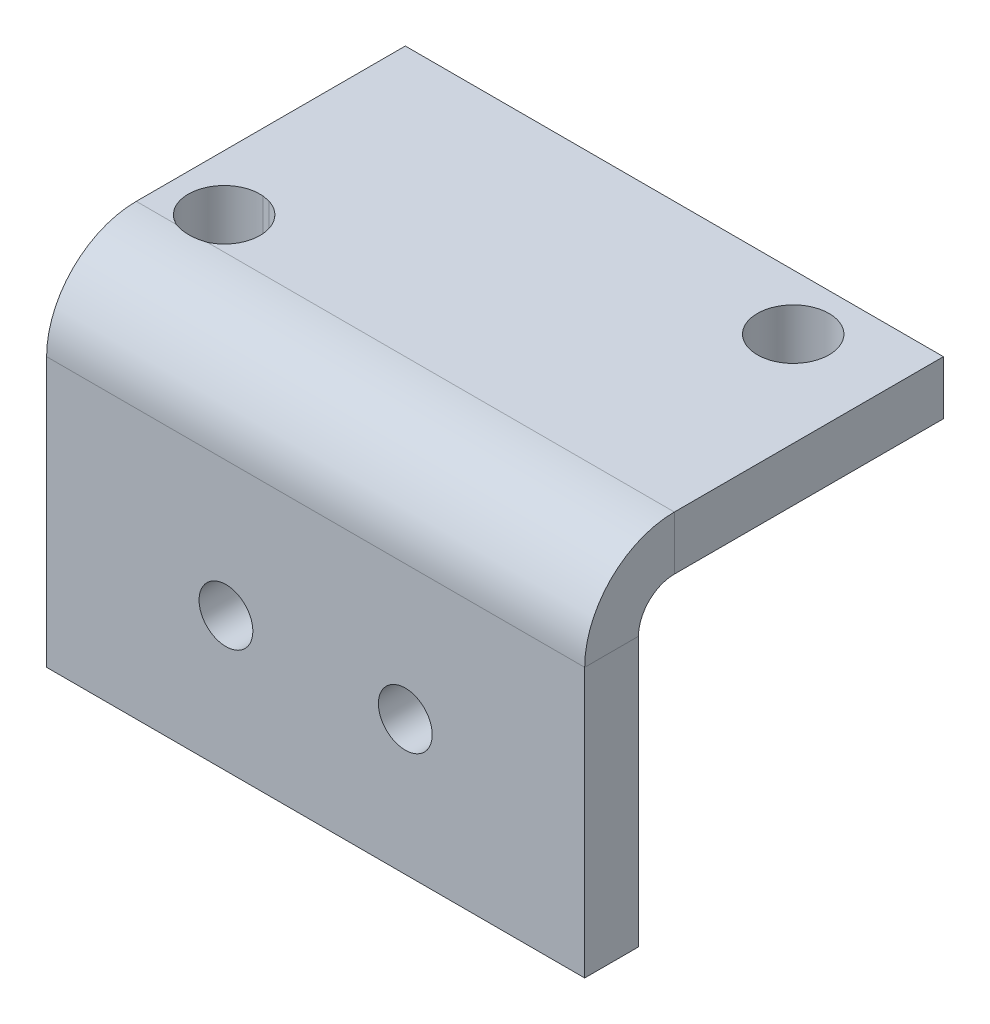
ISO-10303-21;
HEADER;
FILE_DESCRIPTION(('STEP AP214'),'2;1');
FILE_NAME('part.step','',(''),(''),'','','');
FILE_SCHEMA(('AUTOMOTIVE_DESIGN { 1 0 10303 214 1 1 1 1 }'));
ENDSEC;
DATA;
#1=APPLICATION_CONTEXT('core data for automotive mechanical design processes');
#2=APPLICATION_PROTOCOL_DEFINITION('international standard','automotive_design',2000,#1);
#3=PRODUCT_CONTEXT('',#1,'mechanical');
#4=PRODUCT('Part','Part','',(#3));
#5=PRODUCT_RELATED_PRODUCT_CATEGORY('part','',(#4));
#6=PRODUCT_DEFINITION_FORMATION('','',#4);
#7=PRODUCT_DEFINITION_CONTEXT('part definition',#1,'design');
#8=PRODUCT_DEFINITION('design','',#6,#7);
#9=PRODUCT_DEFINITION_SHAPE('','',#8);
#10=(LENGTH_UNIT() NAMED_UNIT(*) SI_UNIT(.MILLI.,.METRE.));
#11=(NAMED_UNIT(*) PLANE_ANGLE_UNIT() SI_UNIT($,.RADIAN.));
#12=(NAMED_UNIT(*) SI_UNIT($,.STERADIAN.) SOLID_ANGLE_UNIT());
#13=UNCERTAINTY_MEASURE_WITH_UNIT(LENGTH_MEASURE(1.E-05),#10,'distance_accuracy_value','');
#14=(GEOMETRIC_REPRESENTATION_CONTEXT(3) GLOBAL_UNCERTAINTY_ASSIGNED_CONTEXT((#13)) GLOBAL_UNIT_ASSIGNED_CONTEXT((#10,
#11,#12)) REPRESENTATION_CONTEXT('',''));
#15=CARTESIAN_POINT('',(0.,0.,0.));
#16=DIRECTION('',(0.,0.,1.));
#17=DIRECTION('',(1.,0.,0.));
#18=AXIS2_PLACEMENT_3D('',#15,#16,#17);
#19=CARTESIAN_POINT('',(30.,-3.,0.));
#20=DIRECTION('',(0.,1.,0.));
#21=DIRECTION('',(0.,0.,1.));
#22=AXIS2_PLACEMENT_3D('',#19,#20,#21);
#23=PLANE('',#22);
#24=DIRECTION('',(-1.,0.,0.));
#25=VECTOR('',#24,1.);
#26=CARTESIAN_POINT('',(30.,-3.,-5.));
#27=LINE('',#26,#25);
#28=CARTESIAN_POINT('',(30.,-3.,-5.));
#29=VERTEX_POINT('',#28);
#30=CARTESIAN_POINT('',(3.97177978870813,-3.,-5.));
#31=VERTEX_POINT('',#30);
#32=EDGE_CURVE('E335',#29,#31,#27,.T.);
#33=ORIENTED_EDGE('',*,*,#32,.T.);
#34=CARTESIAN_POINT('',(3.97177978870813,-3.,-5.));
#35=CARTESIAN_POINT('',(4.08845927120302,-3.,-5.06509952559211));
#36=CARTESIAN_POINT('',(4.3218182361928,-3.,-5.19529857677634));
#37=CARTESIAN_POINT('',(4.61378577689651,-3.,-5.47386881505234));
#38=CARTESIAN_POINT('',(4.84785068816003,-3.,-5.80019538875559));
#39=CARTESIAN_POINT('',(5.0115070238909,-3.,-6.16779528714309));
#40=CARTESIAN_POINT('',(5.09907413861079,-3.,-6.56025196964337));
#41=CARTESIAN_POINT('',(5.10682789130612,-3.,-6.96236621358011));
#42=CARTESIAN_POINT('',(5.03453051747204,-3.,-7.35800376942431));
#43=CARTESIAN_POINT('',(4.88501045455,-3.,-7.73127846452603));
#44=CARTESIAN_POINT('',(4.664386853921,-3.,-8.06778746643363));
#45=CARTESIAN_POINT('',(4.38090562154302,-3.,-8.3522409886111));
#46=CARTESIAN_POINT('',(4.04795226054604,-3.,-8.58025081708027));
#47=CARTESIAN_POINT('',(3.79669753878768,-3.,-8.67124127957223));
#48=CARTESIAN_POINT('',(3.6710701779085,-3.,-8.7167365108182));
#49=B_SPLINE_CURVE_WITH_KNOTS('',3,(#34,#35,#36,#37,#38,#39,#40,#41,#42,#43,#44,#45,#46,#47,
#48),.UNSPECIFIED.,.F.,.F.,(4,1,1,1,1,1,1,1,1,1,1,1,4),(0.,0.0833333333333335,0.166666666666667,
0.25,0.333333333333333,0.416666666666667,0.5,0.583333333333333,0.666666666666667,0.75,
0.833333333333333,0.916666666666667,1.),.UNSPECIFIED.);
#50=CARTESIAN_POINT('',(3.6710701779085,-3.,-8.7167365108182));
#51=VERTEX_POINT('',#50);
#52=EDGE_CURVE('E63',#31,#51,#49,.T.);
#53=ORIENTED_EDGE('',*,*,#52,.T.);
#54=DIRECTION('',(-0.982094208806006,0.,-0.188390458966757));
#55=VECTOR('',#54,1.);
#56=CARTESIAN_POINT('',(3.6710701779085,-3.,-8.7167365108182));
#57=LINE('',#56,#55);
#58=CARTESIAN_POINT('',(3.27872384877918,-3.,-8.7919984402297));
#59=VERTEX_POINT('',#58);
#60=EDGE_CURVE('E134',#51,#59,#57,.T.);
#61=ORIENTED_EDGE('',*,*,#60,.T.);
#62=CARTESIAN_POINT('',(3.27872384877918,-3.,-8.7919984402297));
#63=CARTESIAN_POINT('',(3.14517896328197,-3.,-8.79621898937111));
#64=CARTESIAN_POINT('',(2.87808919228757,-3.,-8.80466008765392));
#65=CARTESIAN_POINT('',(2.48439801057191,-3.,-8.71603900041082));
#66=CARTESIAN_POINT('',(2.11578133247524,-3.,-8.55667440796584));
#67=CARTESIAN_POINT('',(1.78629780870133,-3.,-8.32568950015493));
#68=CARTESIAN_POINT('',(1.50926770016537,-3.,-8.03423915632567));
#69=CARTESIAN_POINT('',(1.29569818968376,-3.,-7.69343337649582));
#70=CARTESIAN_POINT('',(1.15412210646483,-3.,-7.31700720455871));
#71=CARTESIAN_POINT('',(1.09018903178276,-3.,-6.91995134036322));
#72=CARTESIAN_POINT('',(1.10643570736229,-3.,-6.51808623725824));
#73=CARTESIAN_POINT('',(1.20226994711433,-3.,-6.12756331979916));
#74=CARTESIAN_POINT('',(1.37365792776168,-3.,-5.76351850025907));
#75=CARTESIAN_POINT('',(1.61454536105439,-3.,-5.44214396853023));
#76=CARTESIAN_POINT('',(1.90194381095514,-3.,-5.17958863746141));
#77=CARTESIAN_POINT('',(2.12356545291382,-3.,-5.05760393777046));
#78=CARTESIAN_POINT('',(2.22822021129186,-3.,-5.));
#79=B_SPLINE_CURVE_WITH_KNOTS('',3,(#62,#63,#64,#65,#66,#67,#68,#69,#70,#71,#72,#73,#74,#75,#76,
#77,#78),.UNSPECIFIED.,.F.,.F.,(4,1,1,1,1,1,1,1,1,1,1,1,1,1,4),(0.,0.0719696890726234,
0.143939378145247,0.21590906721787,0.287878756290493,0.359848445363116,0.43181813443574,
0.503787823508363,0.575757512580986,0.647727201653609,0.719696890726232,0.791666579798855,
0.863636268871479,0.935605957944102,1.),.UNSPECIFIED.);
#80=CARTESIAN_POINT('',(2.22822021129184,-3.,-5.));
#81=VERTEX_POINT('',#80);
#82=EDGE_CURVE('E141',#59,#81,#79,.T.);
#83=ORIENTED_EDGE('',*,*,#82,.T.);
#84=CARTESIAN_POINT('',(0.,-3.,-5.));
#85=VERTEX_POINT('',#84);
#86=EDGE_CURVE('E308',#81,#85,#27,.T.);
#87=ORIENTED_EDGE('',*,*,#86,.T.);
#88=DIRECTION('',(0.,0.,-1.));
#89=VECTOR('',#88,1.);
#90=CARTESIAN_POINT('',(0.,-3.,0.));
#91=LINE('',#90,#89);
#92=CARTESIAN_POINT('',(0.,-3.,-20.));
#93=VERTEX_POINT('',#92);
#94=EDGE_CURVE('E309',#85,#93,#91,.T.);
#95=ORIENTED_EDGE('',*,*,#94,.T.);
#96=DIRECTION('',(-1.,0.,0.));
#97=VECTOR('',#96,1.);
#98=CARTESIAN_POINT('',(30.,-3.,-20.));
#99=LINE('',#98,#97);
#100=CARTESIAN_POINT('',(30.,-3.,-20.));
#101=VERTEX_POINT('',#100);
#102=EDGE_CURVE('E349',#101,#93,#99,.T.);
#103=ORIENTED_EDGE('',*,*,#102,.F.);
#104=DIRECTION('',(0.,0.,-1.));
#105=VECTOR('',#104,1.);
#106=CARTESIAN_POINT('',(30.,-3.,0.));
#107=LINE('',#106,#105);
#108=EDGE_CURVE('E334',#29,#101,#107,.T.);
#109=ORIENTED_EDGE('',*,*,#108,.F.);
#110=EDGE_LOOP('',(#33,#53,#61,#83,#87,#95,#103,#109));
#111=FACE_BOUND('',#110,.T.);
#112=CARTESIAN_POINT('',(24.725,-3.,-16.9));
#113=DIRECTION('',(0.,-1.,0.));
#114=DIRECTION('',(0.,0.,-1.));
#115=AXIS2_PLACEMENT_3D('',#112,#113,#114);
#116=CIRCLE('',#115,2.);
#117=CARTESIAN_POINT('',(24.725,-3.,-18.9));
#118=VERTEX_POINT('',#117);
#119=EDGE_CURVE('E176',#118,#118,#116,.T.);
#120=ORIENTED_EDGE('',*,*,#119,.F.);
#121=EDGE_LOOP('',(#120));
#122=FACE_BOUND('',#121,.T.);
#123=ADVANCED_FACE('F40',(#111,#122),#23,.F.);
#124=CARTESIAN_POINT('',(30.,0.,0.));
#125=DIRECTION('',(0.,1.,0.));
#126=DIRECTION('',(0.,0.,1.));
#127=AXIS2_PLACEMENT_3D('',#124,#125,#126);
#128=PLANE('',#127);
#129=CARTESIAN_POINT('',(3.97177978870813,0.,-5.));
#130=CARTESIAN_POINT('',(4.08845927120302,0.,-5.06509952559211));
#131=CARTESIAN_POINT('',(4.3218182361928,0.,-5.19529857677634));
#132=CARTESIAN_POINT('',(4.61378577689651,0.,-5.47386881505234));
#133=CARTESIAN_POINT('',(4.84785068816003,0.,-5.80019538875559));
#134=CARTESIAN_POINT('',(5.0115070238909,0.,-6.16779528714309));
#135=CARTESIAN_POINT('',(5.09907413861079,0.,-6.56025196964337));
#136=CARTESIAN_POINT('',(5.10682789130612,0.,-6.96236621358011));
#137=CARTESIAN_POINT('',(5.03453051747204,0.,-7.35800376942431));
#138=CARTESIAN_POINT('',(4.88501045455,0.,-7.73127846452603));
#139=CARTESIAN_POINT('',(4.664386853921,0.,-8.06778746643363));
#140=CARTESIAN_POINT('',(4.38090562154302,0.,-8.3522409886111));
#141=CARTESIAN_POINT('',(4.04795226054604,0.,-8.58025081708027));
#142=CARTESIAN_POINT('',(3.79669753878768,0.,-8.67124127957223));
#143=CARTESIAN_POINT('',(3.6710701779085,0.,-8.7167365108182));
#144=B_SPLINE_CURVE_WITH_KNOTS('',3,(#129,#130,#131,#132,#133,#134,#135,#136,#137,#138,#139,
#140,#141,#142,#143),.UNSPECIFIED.,.F.,.F.,(4,1,1,1,1,1,1,1,1,1,1,1,4),(0.,0.0833333333333335,
0.166666666666667,0.25,0.333333333333333,0.416666666666667,0.5,0.583333333333333,
0.666666666666667,0.75,0.833333333333333,0.916666666666667,1.),.UNSPECIFIED.);
#145=CARTESIAN_POINT('',(3.97177978870812,0.,-5.));
#146=VERTEX_POINT('',#145);
#147=CARTESIAN_POINT('',(3.6710701779085,0.,-8.71673651081821));
#148=VERTEX_POINT('',#147);
#149=EDGE_CURVE('E167',#146,#148,#144,.T.);
#150=ORIENTED_EDGE('',*,*,#149,.F.);
#151=DIRECTION('',(-1.,0.,0.));
#152=VECTOR('',#151,1.);
#153=CARTESIAN_POINT('',(30.,0.,-5.));
#154=LINE('',#153,#152);
#155=CARTESIAN_POINT('',(30.,0.,-5.));
#156=VERTEX_POINT('',#155);
#157=EDGE_CURVE('E290',#156,#146,#154,.T.);
#158=ORIENTED_EDGE('',*,*,#157,.F.);
#159=DIRECTION('',(0.,0.,-1.));
#160=VECTOR('',#159,1.);
#161=CARTESIAN_POINT('',(30.,0.,0.));
#162=LINE('',#161,#160);
#163=CARTESIAN_POINT('',(30.,0.,-20.));
#164=VERTEX_POINT('',#163);
#165=EDGE_CURVE('E279',#156,#164,#162,.T.);
#166=ORIENTED_EDGE('',*,*,#165,.T.);
#167=DIRECTION('',(-1.,0.,0.));
#168=VECTOR('',#167,1.);
#169=CARTESIAN_POINT('',(30.,0.,-20.));
#170=LINE('',#169,#168);
#171=CARTESIAN_POINT('',(0.,0.,-20.));
#172=VERTEX_POINT('',#171);
#173=EDGE_CURVE('E347',#164,#172,#170,.T.);
#174=ORIENTED_EDGE('',*,*,#173,.T.);
#175=DIRECTION('',(0.,0.,-1.));
#176=VECTOR('',#175,1.);
#177=CARTESIAN_POINT('',(0.,0.,0.));
#178=LINE('',#177,#176);
#179=CARTESIAN_POINT('',(0.,0.,-5.));
#180=VERTEX_POINT('',#179);
#181=EDGE_CURVE('E316',#180,#172,#178,.T.);
#182=ORIENTED_EDGE('',*,*,#181,.F.);
#183=CARTESIAN_POINT('',(2.22822021129185,0.,-5.));
#184=VERTEX_POINT('',#183);
#185=EDGE_CURVE('E345',#184,#180,#154,.T.);
#186=ORIENTED_EDGE('',*,*,#185,.F.);
#187=CARTESIAN_POINT('',(3.27872384877918,0.,-8.7919984402297));
#188=CARTESIAN_POINT('',(3.14517896328197,0.,-8.79621898937111));
#189=CARTESIAN_POINT('',(2.87808919228757,0.,-8.80466008765392));
#190=CARTESIAN_POINT('',(2.48439801057191,0.,-8.71603900041082));
#191=CARTESIAN_POINT('',(2.11578133247524,0.,-8.55667440796584));
#192=CARTESIAN_POINT('',(1.78629780870133,0.,-8.32568950015493));
#193=CARTESIAN_POINT('',(1.50926770016537,0.,-8.03423915632567));
#194=CARTESIAN_POINT('',(1.29569818968376,0.,-7.69343337649582));
#195=CARTESIAN_POINT('',(1.15412210646483,0.,-7.31700720455871));
#196=CARTESIAN_POINT('',(1.09018903178276,0.,-6.91995134036322));
#197=CARTESIAN_POINT('',(1.10643570736229,0.,-6.51808623725824));
#198=CARTESIAN_POINT('',(1.20226994711433,0.,-6.12756331979916));
#199=CARTESIAN_POINT('',(1.37365792776168,0.,-5.76351850025907));
#200=CARTESIAN_POINT('',(1.61454536105439,0.,-5.44214396853023));
#201=CARTESIAN_POINT('',(1.90194381095514,0.,-5.17958863746141));
#202=CARTESIAN_POINT('',(2.12356545291382,0.,-5.05760393777046));
#203=CARTESIAN_POINT('',(2.22822021129186,0.,-5.));
#204=B_SPLINE_CURVE_WITH_KNOTS('',3,(#187,#188,#189,#190,#191,#192,#193,#194,#195,#196,#197,
#198,#199,#200,#201,#202,#203),.UNSPECIFIED.,.F.,.F.,(4,1,1,1,1,1,1,1,1,1,1,1,1,1,4),(0.,
0.0719696890726234,0.143939378145247,0.21590906721787,0.287878756290493,0.359848445363116,
0.43181813443574,0.503787823508363,0.575757512580986,0.647727201653609,0.719696890726232,
0.791666579798855,0.863636268871479,0.935605957944102,1.),.UNSPECIFIED.);
#205=CARTESIAN_POINT('',(3.27872384877917,0.,-8.7919984402297));
#206=VERTEX_POINT('',#205);
#207=EDGE_CURVE('E151',#206,#184,#204,.T.);
#208=ORIENTED_EDGE('',*,*,#207,.F.);
#209=DIRECTION('',(-0.982094208806006,0.,-0.188390458966757));
#210=VECTOR('',#209,1.);
#211=CARTESIAN_POINT('',(3.6710701779085,0.,-8.7167365108182));
#212=LINE('',#211,#210);
#213=EDGE_CURVE('E136',#148,#206,#212,.T.);
#214=ORIENTED_EDGE('',*,*,#213,.F.);
#215=EDGE_LOOP('',(#150,#158,#166,#174,#182,#186,#208,#214));
#216=FACE_BOUND('',#215,.T.);
#217=CARTESIAN_POINT('',(24.725,0.,-16.9));
#218=DIRECTION('',(0.,-1.,0.));
#219=DIRECTION('',(0.,0.,1.));
#220=AXIS2_PLACEMENT_3D('',#217,#218,#219);
#221=CIRCLE('',#220,2.);
#222=CARTESIAN_POINT('',(24.725,0.,-18.9));
#223=VERTEX_POINT('',#222);
#224=EDGE_CURVE('E313',#223,#223,#221,.T.);
#225=ORIENTED_EDGE('',*,*,#224,.T.);
#226=EDGE_LOOP('',(#225));
#227=FACE_BOUND('',#226,.T.);
#228=ADVANCED_FACE('F252',(#216,#227),#128,.T.);
#229=CARTESIAN_POINT('',(30.,-5.,-5.));
#230=DIRECTION('',(-1.,0.,0.));
#231=DIRECTION('',(0.,0.,1.));
#232=AXIS2_PLACEMENT_3D('',#229,#230,#231);
#233=CYLINDRICAL_SURFACE('',#232,5.);
#234=ORIENTED_EDGE('',*,*,#157,.T.);
#235=CARTESIAN_POINT('',(3.97177978870811,0.,-5.));
#236=CARTESIAN_POINT('',(3.89577294131122,-6.61739132630226E-06,-4.97492425683757));
#237=CARTESIAN_POINT('',(3.81881210650218,-0.000189643118163191,-4.9525799113716));
#238=CARTESIAN_POINT('',(3.66331319060247,-0.000700486276422435,-4.91399659291819));
#239=CARTESIAN_POINT('',(3.58477382531683,-0.00102842656264075,-4.89776282198794));
#240=CARTESIAN_POINT('',(3.43360819381328,-0.00159405331627685,-4.87322889231804));
#241=CARTESIAN_POINT('',(3.36107670059047,-0.00183717051269669,-4.86435190092651));
#242=CARTESIAN_POINT('',(3.21555708377948,-0.00216800740711341,-4.8526507235059));
#243=CARTESIAN_POINT('',(3.14256922835525,-0.00225581107452708,-4.84982326665541));
#244=CARTESIAN_POINT('',(2.99831607282394,-0.00223585730524197,-4.85048824731048));
#245=CARTESIAN_POINT('',(2.92705018618855,-0.00213260016126816,-4.85383524464928));
#246=CARTESIAN_POINT('',(2.78503436994497,-0.00177426907550404,-4.86666141085332));
#247=CARTESIAN_POINT('',(2.714284714287,-0.00151911972791981,-4.87614362570649));
#248=CARTESIAN_POINT('',(2.57334166675231,-0.000958601413779234,-4.90126174354977));
#249=CARTESIAN_POINT('',(2.50315647375725,-0.000652868799404949,-4.91694344114359));
#250=CARTESIAN_POINT('',(2.36438240689695,-0.000177906498208284,-4.95415801379688));
#251=CARTESIAN_POINT('',(2.29579290134599,-8.621870904472E-06,-4.97568852916911));
#252=CARTESIAN_POINT('',(2.22822021129183,0.,-5.));
#253=B_SPLINE_CURVE_WITH_KNOTS('',3,(#235,#236,#237,#238,#239,#240,#241,#242,#243,#244,#245,
#246,#247,#248,#249,#250,#251,#252),.UNSPECIFIED.,.F.,.F.,(4,2,2,2,2,2,2,2,4),(0.,
0.240134820933939,0.480473613667133,0.699454218632474,0.918316396694728,1.13208893133668,
1.34596768042365,1.56145675794745,1.77685902586426),.UNSPECIFIED.);
#254=EDGE_CURVE('E217',#146,#184,#253,.T.);
#255=ORIENTED_EDGE('',*,*,#254,.T.);
#256=ORIENTED_EDGE('',*,*,#185,.T.);
#257=CARTESIAN_POINT('',(0.,-5.,-5.));
#258=DIRECTION('',(1.,0.,0.));
#259=DIRECTION('',(0.,0.,-1.));
#260=AXIS2_PLACEMENT_3D('',#257,#258,#259);
#261=CIRCLE('',#260,5.);
#262=CARTESIAN_POINT('',(0.,-5.,0.));
#263=VERTEX_POINT('',#262);
#264=EDGE_CURVE('E319',#263,#180,#261,.F.);
#265=ORIENTED_EDGE('',*,*,#264,.F.);
#266=DIRECTION('',(-1.,0.,0.));
#267=VECTOR('',#266,1.);
#268=CARTESIAN_POINT('',(30.,-5.,0.));
#269=LINE('',#268,#267);
#270=CARTESIAN_POINT('',(30.,-5.,0.));
#271=VERTEX_POINT('',#270);
#272=EDGE_CURVE('E293',#271,#263,#269,.T.);
#273=ORIENTED_EDGE('',*,*,#272,.F.);
#274=CARTESIAN_POINT('',(30.,-5.,-5.));
#275=DIRECTION('',(1.,0.,0.));
#276=DIRECTION('',(0.,0.,-1.));
#277=AXIS2_PLACEMENT_3D('',#274,#275,#276);
#278=CIRCLE('',#277,5.);
#279=EDGE_CURVE('E285',#271,#156,#278,.F.);
#280=ORIENTED_EDGE('',*,*,#279,.T.);
#281=EDGE_LOOP('',(#234,#255,#256,#265,#273,#280));
#282=FACE_BOUND('',#281,.T.);
#283=ADVANCED_FACE('F236',(#282),#233,.T.);
#284=CARTESIAN_POINT('',(30.,-5.,-5.));
#285=DIRECTION('',(-1.,0.,0.));
#286=DIRECTION('',(0.,0.,1.));
#287=AXIS2_PLACEMENT_3D('',#284,#285,#286);
#288=CYLINDRICAL_SURFACE('',#287,2.);
#289=CARTESIAN_POINT('',(3.9717797887081,-3.,-5.));
#290=CARTESIAN_POINT('',(3.89263109664244,-3.00000470233901,-4.9895609225812));
#291=CARTESIAN_POINT('',(3.81330913854638,-3.00008199869508,-4.9804083132394));
#292=CARTESIAN_POINT('',(3.65438776923154,-3.00029331881966,-4.9647975176824));
#293=CARTESIAN_POINT('',(3.57478831358932,-3.00042735212753,-4.95833978492744));
#294=CARTESIAN_POINT('',(3.41540138455945,-3.00066363379398,-4.94824342329122));
#295=CARTESIAN_POINT('',(3.33561389675117,-3.0007658796291,-4.94460501818837));
#296=CARTESIAN_POINT('',(3.17596858742451,-3.00089131388268,-4.94026548102431));
#297=CARTESIAN_POINT('',(3.09611077178366,-3.00091450837722,-4.93956412321346));
#298=CARTESIAN_POINT('',(2.88452097979663,-3.0008458784219,-4.94174605146377));
#299=CARTESIAN_POINT('',(2.75279976341055,-3.00066952263319,-4.94725473042592));
#300=CARTESIAN_POINT('',(2.55567374493875,-3.0003547233086,-4.96205757447522));
#301=CARTESIAN_POINT('',(2.49000767088179,-3.00024134193416,-4.96808657200069));
#302=CARTESIAN_POINT('',(2.35891615219341,-3.00006552874346,-4.9823667684244));
#303=CARTESIAN_POINT('',(2.2934907135738,-3.00000309819162,-4.99061802246437));
#304=CARTESIAN_POINT('',(2.22822021129183,-3.,-5.));
#305=B_SPLINE_CURVE_WITH_KNOTS('',3,(#289,#290,#291,#292,#293,#294,#295,#296,#297,#298,#299,
#300,#301,#302,#303,#304),.UNSPECIFIED.,.F.,.F.,(4,2,2,2,2,2,2,4),(0.,0.239496847314258,
0.479033977938381,0.718590119389495,0.958127847550098,1.35331452566296,1.5511096928524,
1.74890976846549),.UNSPECIFIED.);
#306=EDGE_CURVE('E210',#31,#81,#305,.T.);
#307=ORIENTED_EDGE('',*,*,#306,.F.);
#308=ORIENTED_EDGE('',*,*,#32,.F.);
#309=CARTESIAN_POINT('',(30.,-5.,-5.));
#310=DIRECTION('',(1.,0.,0.));
#311=DIRECTION('',(0.,0.,-1.));
#312=AXIS2_PLACEMENT_3D('',#309,#310,#311);
#313=CIRCLE('',#312,2.);
#314=CARTESIAN_POINT('',(30.,-5.,-3.));
#315=VERTEX_POINT('',#314);
#316=EDGE_CURVE('E306',#315,#29,#313,.F.);
#317=ORIENTED_EDGE('',*,*,#316,.F.);
#318=DIRECTION('',(-1.,0.,0.));
#319=VECTOR('',#318,1.);
#320=CARTESIAN_POINT('',(30.,-5.,-3.));
#321=LINE('',#320,#319);
#322=CARTESIAN_POINT('',(0.,-5.,-3.));
#323=VERTEX_POINT('',#322);
#324=EDGE_CURVE('E337',#315,#323,#321,.T.);
#325=ORIENTED_EDGE('',*,*,#324,.T.);
#326=CARTESIAN_POINT('',(0.,-5.,-5.));
#327=DIRECTION('',(1.,0.,0.));
#328=DIRECTION('',(0.,0.,-1.));
#329=AXIS2_PLACEMENT_3D('',#326,#327,#328);
#330=CIRCLE('',#329,2.);
#331=EDGE_CURVE('E331',#323,#85,#330,.F.);
#332=ORIENTED_EDGE('',*,*,#331,.T.);
#333=ORIENTED_EDGE('',*,*,#86,.F.);
#334=EDGE_LOOP('',(#307,#308,#317,#325,#332,#333));
#335=FACE_BOUND('',#334,.T.);
#336=ADVANCED_FACE('F233',(#335),#288,.F.);
#337=CARTESIAN_POINT('',(30.,0.,-5.));
#338=DIRECTION('',(1.,0.,0.));
#339=DIRECTION('',(0.,0.,-1.));
#340=AXIS2_PLACEMENT_3D('',#337,#338,#339);
#341=PLANE('',#340);
#342=DIRECTION('',(0.,-1.,0.));
#343=VECTOR('',#342,1.);
#344=CARTESIAN_POINT('',(30.,0.,-5.));
#345=LINE('',#344,#343);
#346=EDGE_CURVE('E11',#156,#29,#345,.T.);
#347=ORIENTED_EDGE('',*,*,#346,.F.);
#348=ORIENTED_EDGE('',*,*,#279,.F.);
#349=DIRECTION('',(0.,0.,1.));
#350=VECTOR('',#349,1.);
#351=CARTESIAN_POINT('',(30.,-5.,-3.));
#352=LINE('',#351,#350);
#353=EDGE_CURVE('E48',#315,#271,#352,.T.);
#354=ORIENTED_EDGE('',*,*,#353,.F.);
#355=ORIENTED_EDGE('',*,*,#316,.T.);
#356=EDGE_LOOP('',(#347,#348,#354,#355));
#357=FACE_BOUND('',#356,.T.);
#358=ADVANCED_FACE('F42',(#357),#341,.T.);
#359=CARTESIAN_POINT('',(30.,-5.,-3.));
#360=DIRECTION('',(1.,0.,0.));
#361=DIRECTION('',(0.,0.,-1.));
#362=AXIS2_PLACEMENT_3D('',#359,#360,#361);
#363=PLANE('',#362);
#364=ORIENTED_EDGE('',*,*,#165,.F.);
#365=ORIENTED_EDGE('',*,*,#346,.T.);
#366=ORIENTED_EDGE('',*,*,#108,.T.);
#367=DIRECTION('',(0.,-1.,0.));
#368=VECTOR('',#367,1.);
#369=CARTESIAN_POINT('',(30.,0.,-20.));
#370=LINE('',#369,#368);
#371=EDGE_CURVE('E283',#164,#101,#370,.T.);
#372=ORIENTED_EDGE('',*,*,#371,.F.);
#373=EDGE_LOOP('',(#364,#365,#366,#372));
#374=FACE_BOUND('',#373,.T.);
#375=ADVANCED_FACE('F268',(#374),#363,.T.);
#376=CARTESIAN_POINT('',(0.,-5.,0.));
#377=DIRECTION('',(-1.,0.,0.));
#378=DIRECTION('',(0.,0.,1.));
#379=AXIS2_PLACEMENT_3D('',#376,#377,#378);
#380=PLANE('',#379);
#381=DIRECTION('',(0.,0.,-1.));
#382=VECTOR('',#381,1.);
#383=CARTESIAN_POINT('',(0.,-5.,0.));
#384=LINE('',#383,#382);
#385=EDGE_CURVE('E354',#263,#323,#384,.T.);
#386=ORIENTED_EDGE('',*,*,#385,.F.);
#387=ORIENTED_EDGE('',*,*,#264,.T.);
#388=DIRECTION('',(0.,1.,0.));
#389=VECTOR('',#388,1.);
#390=CARTESIAN_POINT('',(0.,-3.,-5.));
#391=LINE('',#390,#389);
#392=EDGE_CURVE('E351',#85,#180,#391,.T.);
#393=ORIENTED_EDGE('',*,*,#392,.F.);
#394=ORIENTED_EDGE('',*,*,#331,.F.);
#395=EDGE_LOOP('',(#386,#387,#393,#394));
#396=FACE_BOUND('',#395,.T.);
#397=ADVANCED_FACE('F265',(#396),#380,.T.);
#398=CARTESIAN_POINT('',(0.,-3.,-5.));
#399=DIRECTION('',(-1.,0.,0.));
#400=DIRECTION('',(0.,0.,1.));
#401=AXIS2_PLACEMENT_3D('',#398,#399,#400);
#402=PLANE('',#401);
#403=DIRECTION('',(0.,1.,0.));
#404=VECTOR('',#403,1.);
#405=CARTESIAN_POINT('',(0.,-20.,0.));
#406=LINE('',#405,#404);
#407=CARTESIAN_POINT('',(0.,-20.,0.));
#408=VERTEX_POINT('',#407);
#409=EDGE_CURVE('E322',#408,#263,#406,.T.);
#410=ORIENTED_EDGE('',*,*,#409,.T.);
#411=ORIENTED_EDGE('',*,*,#385,.T.);
#412=DIRECTION('',(0.,1.,0.));
#413=VECTOR('',#412,1.);
#414=CARTESIAN_POINT('',(0.,-20.,-3.));
#415=LINE('',#414,#413);
#416=CARTESIAN_POINT('',(0.,-20.,-3.));
#417=VERTEX_POINT('',#416);
#418=EDGE_CURVE('E328',#417,#323,#415,.T.);
#419=ORIENTED_EDGE('',*,*,#418,.F.);
#420=DIRECTION('',(0.,0.,1.));
#421=VECTOR('',#420,1.);
#422=CARTESIAN_POINT('',(0.,-20.,-3.));
#423=LINE('',#422,#421);
#424=EDGE_CURVE('E325',#417,#408,#423,.T.);
#425=ORIENTED_EDGE('',*,*,#424,.T.);
#426=EDGE_LOOP('',(#410,#411,#419,#425));
#427=FACE_BOUND('',#426,.T.);
#428=ADVANCED_FACE('F259',(#427),#402,.T.);
#429=CARTESIAN_POINT('',(30.,0.,-20.));
#430=DIRECTION('',(0.,0.,-1.));
#431=DIRECTION('',(-1.,0.,0.));
#432=AXIS2_PLACEMENT_3D('',#429,#430,#431);
#433=PLANE('',#432);
#434=DIRECTION('',(0.,-1.,0.));
#435=VECTOR('',#434,1.);
#436=CARTESIAN_POINT('',(0.,0.,-20.));
#437=LINE('',#436,#435);
#438=EDGE_CURVE('E312',#172,#93,#437,.T.);
#439=ORIENTED_EDGE('',*,*,#438,.F.);
#440=ORIENTED_EDGE('',*,*,#173,.F.);
#441=ORIENTED_EDGE('',*,*,#371,.T.);
#442=ORIENTED_EDGE('',*,*,#102,.T.);
#443=EDGE_LOOP('',(#439,#440,#441,#442));
#444=FACE_BOUND('',#443,.T.);
#445=ADVANCED_FACE('F248',(#444),#433,.T.);
#446=CARTESIAN_POINT('',(30.,-20.,0.));
#447=DIRECTION('',(0.,0.,1.));
#448=DIRECTION('',(1.,0.,0.));
#449=AXIS2_PLACEMENT_3D('',#446,#447,#448);
#450=PLANE('',#449);
#451=CARTESIAN_POINT('',(10.,-12.5,0.));
#452=DIRECTION('',(0.,0.,1.));
#453=DIRECTION('',(1.,0.,0.));
#454=AXIS2_PLACEMENT_3D('',#451,#452,#453);
#455=CIRCLE('',#454,1.5);
#456=CARTESIAN_POINT('',(11.5,-12.5,0.));
#457=VERTEX_POINT('',#456);
#458=EDGE_CURVE('E371',#457,#457,#455,.T.);
#459=ORIENTED_EDGE('',*,*,#458,.F.);
#460=EDGE_LOOP('',(#459));
#461=FACE_BOUND('',#460,.T.);
#462=CARTESIAN_POINT('',(20.,-12.5,0.));
#463=DIRECTION('',(0.,0.,1.));
#464=DIRECTION('',(1.,0.,0.));
#465=AXIS2_PLACEMENT_3D('',#462,#463,#464);
#466=CIRCLE('',#465,1.5);
#467=CARTESIAN_POINT('',(21.5,-12.5,0.));
#468=VERTEX_POINT('',#467);
#469=EDGE_CURVE('E380',#468,#468,#466,.T.);
#470=ORIENTED_EDGE('',*,*,#469,.F.);
#471=EDGE_LOOP('',(#470));
#472=FACE_BOUND('',#471,.T.);
#473=ORIENTED_EDGE('',*,*,#409,.F.);
#474=DIRECTION('',(-1.,0.,0.));
#475=VECTOR('',#474,1.);
#476=CARTESIAN_POINT('',(30.,-20.,0.));
#477=LINE('',#476,#475);
#478=CARTESIAN_POINT('',(30.,-20.,0.));
#479=VERTEX_POINT('',#478);
#480=EDGE_CURVE('E342',#479,#408,#477,.T.);
#481=ORIENTED_EDGE('',*,*,#480,.F.);
#482=DIRECTION('',(0.,1.,0.));
#483=VECTOR('',#482,1.);
#484=CARTESIAN_POINT('',(30.,-20.,0.));
#485=LINE('',#484,#483);
#486=EDGE_CURVE('E295',#479,#271,#485,.T.);
#487=ORIENTED_EDGE('',*,*,#486,.T.);
#488=ORIENTED_EDGE('',*,*,#272,.T.);
#489=EDGE_LOOP('',(#473,#481,#487,#488));
#490=FACE_BOUND('',#489,.T.);
#491=ADVANCED_FACE('F244',(#461,#472,#490),#450,.T.);
#492=CARTESIAN_POINT('',(30.,-20.,-3.));
#493=DIRECTION('',(0.,-1.,0.));
#494=DIRECTION('',(0.,0.,-1.));
#495=AXIS2_PLACEMENT_3D('',#492,#493,#494);
#496=PLANE('',#495);
#497=ORIENTED_EDGE('',*,*,#424,.F.);
#498=DIRECTION('',(-1.,0.,0.));
#499=VECTOR('',#498,1.);
#500=CARTESIAN_POINT('',(30.,-20.,-3.));
#501=LINE('',#500,#499);
#502=CARTESIAN_POINT('',(30.,-20.,-3.));
#503=VERTEX_POINT('',#502);
#504=EDGE_CURVE('E340',#503,#417,#501,.T.);
#505=ORIENTED_EDGE('',*,*,#504,.F.);
#506=DIRECTION('',(0.,0.,1.));
#507=VECTOR('',#506,1.);
#508=CARTESIAN_POINT('',(30.,-20.,-3.));
#509=LINE('',#508,#507);
#510=EDGE_CURVE('E297',#503,#479,#509,.T.);
#511=ORIENTED_EDGE('',*,*,#510,.T.);
#512=ORIENTED_EDGE('',*,*,#480,.T.);
#513=EDGE_LOOP('',(#497,#505,#511,#512));
#514=FACE_BOUND('',#513,.T.);
#515=ADVANCED_FACE('F240',(#514),#496,.T.);
#516=CARTESIAN_POINT('',(30.,-20.,-3.));
#517=DIRECTION('',(0.,0.,1.));
#518=DIRECTION('',(1.,0.,0.));
#519=AXIS2_PLACEMENT_3D('',#516,#517,#518);
#520=PLANE('',#519);
#521=CARTESIAN_POINT('',(10.,-12.5,-3.));
#522=DIRECTION('',(0.,0.,1.));
#523=DIRECTION('',(1.,0.,0.));
#524=AXIS2_PLACEMENT_3D('',#521,#522,#523);
#525=CIRCLE('',#524,1.5);
#526=CARTESIAN_POINT('',(11.5,-12.5,-3.));
#527=VERTEX_POINT('',#526);
#528=EDGE_CURVE('E369',#527,#527,#525,.T.);
#529=ORIENTED_EDGE('',*,*,#528,.T.);
#530=EDGE_LOOP('',(#529));
#531=FACE_BOUND('',#530,.T.);
#532=CARTESIAN_POINT('',(20.,-12.5,-3.));
#533=DIRECTION('',(0.,0.,1.));
#534=DIRECTION('',(1.,0.,0.));
#535=AXIS2_PLACEMENT_3D('',#532,#533,#534);
#536=CIRCLE('',#535,1.5);
#537=CARTESIAN_POINT('',(21.5,-12.5,-3.));
#538=VERTEX_POINT('',#537);
#539=EDGE_CURVE('E375',#538,#538,#536,.T.);
#540=ORIENTED_EDGE('',*,*,#539,.T.);
#541=EDGE_LOOP('',(#540));
#542=FACE_BOUND('',#541,.T.);
#543=ORIENTED_EDGE('',*,*,#418,.T.);
#544=ORIENTED_EDGE('',*,*,#324,.F.);
#545=DIRECTION('',(0.,1.,0.));
#546=VECTOR('',#545,1.);
#547=CARTESIAN_POINT('',(30.,-20.,-3.));
#548=LINE('',#547,#546);
#549=EDGE_CURVE('E303',#503,#315,#548,.T.);
#550=ORIENTED_EDGE('',*,*,#549,.F.);
#551=ORIENTED_EDGE('',*,*,#504,.T.);
#552=EDGE_LOOP('',(#543,#544,#550,#551));
#553=FACE_BOUND('',#552,.T.);
#554=ADVANCED_FACE('F228',(#531,#542,#553),#520,.F.);
#555=CARTESIAN_POINT('',(30.,-5.,-5.));
#556=DIRECTION('',(1.,0.,0.));
#557=DIRECTION('',(0.,0.,-1.));
#558=AXIS2_PLACEMENT_3D('',#555,#556,#557);
#559=PLANE('',#558);
#560=ORIENTED_EDGE('',*,*,#549,.T.);
#561=ORIENTED_EDGE('',*,*,#353,.T.);
#562=ORIENTED_EDGE('',*,*,#486,.F.);
#563=ORIENTED_EDGE('',*,*,#510,.F.);
#564=EDGE_LOOP('',(#560,#561,#562,#563));
#565=FACE_BOUND('',#564,.T.);
#566=ADVANCED_FACE('F225',(#565),#559,.T.);
#567=CARTESIAN_POINT('',(0.,-5.,-5.));
#568=DIRECTION('',(1.,0.,0.));
#569=DIRECTION('',(0.,0.,-1.));
#570=AXIS2_PLACEMENT_3D('',#567,#568,#569);
#571=PLANE('',#570);
#572=ORIENTED_EDGE('',*,*,#94,.F.);
#573=ORIENTED_EDGE('',*,*,#392,.T.);
#574=ORIENTED_EDGE('',*,*,#181,.T.);
#575=ORIENTED_EDGE('',*,*,#438,.T.);
#576=EDGE_LOOP('',(#572,#573,#574,#575));
#577=FACE_BOUND('',#576,.T.);
#578=ADVANCED_FACE('F200',(#577),#571,.F.);
#579=CARTESIAN_POINT('',(3.97177978870811,0.0299999999999991,-5.));
#580=CARTESIAN_POINT('',(3.66869673188539,0.0299999999999991,-4.89947359325099));
#581=CARTESIAN_POINT('',(3.37186039836353,0.0277399978133648,-4.84923357672326));
#582=CARTESIAN_POINT('',(2.7906738725581,0.0277399978133649,-4.84923357672327));
#583=CARTESIAN_POINT('',(2.50632620073641,0.0299999999999992,-4.89947352645706));
#584=CARTESIAN_POINT('',(2.22822021129183,0.0299999999999991,-5.));
#585=CARTESIAN_POINT('',(3.97177978870811,0.,-5.));
#586=CARTESIAN_POINT('',(3.66869674185573,0.,-4.90007315563209));
#587=CARTESIAN_POINT('',(3.37186039836353,-0.00224652304834513,-4.850132780043));
#588=CARTESIAN_POINT('',(2.7906738725581,-0.00224652304834508,-4.85013278004301));
#589=CARTESIAN_POINT('',(2.50632619010107,0.,-4.90007308944893));
#590=CARTESIAN_POINT('',(2.22822021129183,0.,-5.));
#591=CARTESIAN_POINT('',(3.9717797887081,-3.,-5.));
#592=CARTESIAN_POINT('',(3.66869773889062,-3.,-4.96002939374228));
#593=CARTESIAN_POINT('',(3.37186039836352,-3.00089860921934,-4.9400531120172));
#594=CARTESIAN_POINT('',(2.79067387255809,-3.00089860921934,-4.9400531120172));
#595=CARTESIAN_POINT('',(2.50632512656693,-3.,-4.96002938863595));
#596=CARTESIAN_POINT('',(2.22822021129183,-3.,-5.));
#597=CARTESIAN_POINT('',(3.9717797887081,-3.0303,-5.));
#598=CARTESIAN_POINT('',(3.66869774896067,-3.0303,-4.96063495174719));
#599=CARTESIAN_POINT('',(3.37186039836352,-3.03118499528967,-4.94096130737014));
#600=CARTESIAN_POINT('',(2.79067387255809,-3.03118499528967,-4.94096130737014));
#601=CARTESIAN_POINT('',(2.50632511582523,-3.0303,-4.96063494725774));
#602=CARTESIAN_POINT('',(2.22822021129183,-3.0303,-5.));
#603=B_SPLINE_SURFACE_WITH_KNOTS('',1,3,((#579,#580,#581,#582,#583,#584),(#585,#586,#587,#588,
#589,#590),(#591,#592,#593,#594,#595,#596),(#597,#598,#599,#600,#601,#602)),.UNSPECIFIED.,.F.,
.F.,.F.,(2,1,1,2),(4,2,4),(-0.01,0.,1.,1.0101),(0.,0.5,1.),.UNSPECIFIED.);
#604=DIRECTION('',(0.,1.,0.));
#605=VECTOR('',#604,1.);
#606=CARTESIAN_POINT('',(3.97177978870813,-3.,-5.));
#607=LINE('',#606,#605);
#608=EDGE_CURVE('E145',#146,#31,#607,.F.);
#609=DIRECTION('',(0.,1.,0.));
#610=VECTOR('',#609,1.);
#611=CARTESIAN_POINT('',(2.22822021129186,-3.,-5.));
#612=LINE('',#611,#610);
#613=EDGE_CURVE('E55',#184,#81,#612,.F.);
#614=ORIENTED_EDGE('',*,*,#608,.T.);
#615=ORIENTED_EDGE('',*,*,#306,.T.);
#616=ORIENTED_EDGE('',*,*,#613,.F.);
#617=ORIENTED_EDGE('',*,*,#254,.F.);
#618=EDGE_LOOP('',(#614,#615,#616,#617));
#619=FACE_BOUND('',#618,.T.);
#620=ADVANCED_FACE('F194',(#619),#603,.T.);
#621=DIRECTION('',(0.,1.,0.));
#622=VECTOR('',#621,1.);
#623=SURFACE_OF_LINEAR_EXTRUSION('',#49,#622);
#624=ORIENTED_EDGE('',*,*,#608,.F.);
#625=ORIENTED_EDGE('',*,*,#149,.T.);
#626=DIRECTION('',(0.,1.,0.));
#627=VECTOR('',#626,1.);
#628=CARTESIAN_POINT('',(3.6710701779085,-3.,-8.7167365108182));
#629=LINE('',#628,#627);
#630=EDGE_CURVE('E149',#148,#51,#629,.F.);
#631=ORIENTED_EDGE('',*,*,#630,.T.);
#632=ORIENTED_EDGE('',*,*,#52,.F.);
#633=EDGE_LOOP('',(#624,#625,#631,#632));
#634=FACE_BOUND('',#633,.T.);
#635=ADVANCED_FACE('F190',(#634),#623,.F.);
#636=DIRECTION('',(0.,1.,0.));
#637=VECTOR('',#636,1.);
#638=SURFACE_OF_LINEAR_EXTRUSION('',#79,#637);
#639=DIRECTION('',(0.,1.,0.));
#640=VECTOR('',#639,1.);
#641=CARTESIAN_POINT('',(3.27872384877918,-3.,-8.7919984402297));
#642=LINE('',#641,#640);
#643=EDGE_CURVE('E129',#206,#59,#642,.F.);
#644=ORIENTED_EDGE('',*,*,#643,.F.);
#645=ORIENTED_EDGE('',*,*,#207,.T.);
#646=ORIENTED_EDGE('',*,*,#613,.T.);
#647=ORIENTED_EDGE('',*,*,#82,.F.);
#648=EDGE_LOOP('',(#644,#645,#646,#647));
#649=FACE_BOUND('',#648,.T.);
#650=ADVANCED_FACE('F142',(#649),#638,.F.);
#651=CARTESIAN_POINT('',(3.6710701779085,-3.,-8.7167365108182));
#652=DIRECTION('',(0.188390458966757,0.,-0.982094208806006));
#653=DIRECTION('',(-0.982094208806006,0.,-0.188390458966757));
#654=AXIS2_PLACEMENT_3D('',#651,#652,#653);
#655=PLANE('',#654);
#656=ORIENTED_EDGE('',*,*,#213,.T.);
#657=ORIENTED_EDGE('',*,*,#643,.T.);
#658=ORIENTED_EDGE('',*,*,#60,.F.);
#659=ORIENTED_EDGE('',*,*,#630,.F.);
#660=EDGE_LOOP('',(#656,#657,#658,#659));
#661=FACE_BOUND('',#660,.T.);
#662=ADVANCED_FACE('F131',(#661),#655,.F.);
#663=CARTESIAN_POINT('',(24.725,0.,-16.9));
#664=DIRECTION('',(0.,-1.,0.));
#665=DIRECTION('',(0.,0.,-1.));
#666=AXIS2_PLACEMENT_3D('',#663,#664,#665);
#667=CYLINDRICAL_SURFACE('',#666,2.);
#668=CARTESIAN_POINT('',(24.725,0.,-18.9));
#669=CARTESIAN_POINT('',(24.725,-0.0312499999999999,-18.9));
#670=CARTESIAN_POINT('',(24.725,-0.0624999999999999,-18.9));
#671=CARTESIAN_POINT('',(24.725,-0.125,-18.9));
#672=CARTESIAN_POINT('',(24.725,-0.15625,-18.9));
#673=CARTESIAN_POINT('',(24.725,-0.21875,-18.9));
#674=CARTESIAN_POINT('',(24.725,-0.25,-18.9));
#675=CARTESIAN_POINT('',(24.725,-0.3125,-18.9));
#676=CARTESIAN_POINT('',(24.725,-0.34375,-18.9));
#677=CARTESIAN_POINT('',(24.725,-0.40625,-18.9));
#678=CARTESIAN_POINT('',(24.725,-0.4375,-18.9));
#679=CARTESIAN_POINT('',(24.725,-0.5,-18.9));
#680=CARTESIAN_POINT('',(24.725,-0.53125,-18.9));
#681=CARTESIAN_POINT('',(24.725,-0.59375,-18.9));
#682=CARTESIAN_POINT('',(24.725,-0.624999999999999,-18.9));
#683=CARTESIAN_POINT('',(24.725,-0.687499999999999,-18.9));
#684=CARTESIAN_POINT('',(24.725,-0.718749999999999,-18.9));
#685=CARTESIAN_POINT('',(24.725,-0.781249999999999,-18.9));
#686=CARTESIAN_POINT('',(24.725,-0.812499999999999,-18.9));
#687=CARTESIAN_POINT('',(24.725,-0.874999999999999,-18.9));
#688=CARTESIAN_POINT('',(24.725,-0.906249999999999,-18.9));
#689=CARTESIAN_POINT('',(24.725,-0.968749999999999,-18.9));
#690=CARTESIAN_POINT('',(24.725,-0.999999999999999,-18.9));
#691=CARTESIAN_POINT('',(24.725,-1.0625,-18.9));
#692=CARTESIAN_POINT('',(24.725,-1.09375,-18.9));
#693=CARTESIAN_POINT('',(24.725,-1.15625,-18.9));
#694=CARTESIAN_POINT('',(24.725,-1.1875,-18.9));
#695=CARTESIAN_POINT('',(24.725,-1.25,-18.9));
#696=CARTESIAN_POINT('',(24.725,-1.28125,-18.9));
#697=CARTESIAN_POINT('',(24.725,-1.34375,-18.9));
#698=CARTESIAN_POINT('',(24.725,-1.375,-18.9));
#699=CARTESIAN_POINT('',(24.725,-1.4375,-18.9));
#700=CARTESIAN_POINT('',(24.725,-1.46875,-18.9));
#701=CARTESIAN_POINT('',(24.725,-1.53125,-18.9));
#702=CARTESIAN_POINT('',(24.725,-1.5625,-18.9));
#703=CARTESIAN_POINT('',(24.725,-1.625,-18.9));
#704=CARTESIAN_POINT('',(24.725,-1.65625,-18.9));
#705=CARTESIAN_POINT('',(24.725,-1.71875,-18.9));
#706=CARTESIAN_POINT('',(24.725,-1.75,-18.9));
#707=CARTESIAN_POINT('',(24.725,-1.8125,-18.9));
#708=CARTESIAN_POINT('',(24.725,-1.84375,-18.9));
#709=CARTESIAN_POINT('',(24.725,-1.90625,-18.9));
#710=CARTESIAN_POINT('',(24.725,-1.9375,-18.9));
#711=CARTESIAN_POINT('',(24.725,-2.,-18.9));
#712=CARTESIAN_POINT('',(24.725,-2.03125,-18.9));
#713=CARTESIAN_POINT('',(24.725,-2.09375,-18.9));
#714=CARTESIAN_POINT('',(24.725,-2.125,-18.9));
#715=CARTESIAN_POINT('',(24.725,-2.1875,-18.9));
#716=CARTESIAN_POINT('',(24.725,-2.21875,-18.9));
#717=CARTESIAN_POINT('',(24.725,-2.28125,-18.9));
#718=CARTESIAN_POINT('',(24.725,-2.3125,-18.9));
#719=CARTESIAN_POINT('',(24.725,-2.375,-18.9));
#720=CARTESIAN_POINT('',(24.725,-2.40625,-18.9));
#721=CARTESIAN_POINT('',(24.725,-2.46875,-18.9));
#722=CARTESIAN_POINT('',(24.725,-2.5,-18.9));
#723=CARTESIAN_POINT('',(24.725,-2.5625,-18.9));
#724=CARTESIAN_POINT('',(24.725,-2.59375,-18.9));
#725=CARTESIAN_POINT('',(24.725,-2.65625,-18.9));
#726=CARTESIAN_POINT('',(24.725,-2.6875,-18.9));
#727=CARTESIAN_POINT('',(24.725,-2.75,-18.9));
#728=CARTESIAN_POINT('',(24.725,-2.78125,-18.9));
#729=CARTESIAN_POINT('',(24.725,-2.84375,-18.9));
#730=CARTESIAN_POINT('',(24.725,-2.875,-18.9));
#731=CARTESIAN_POINT('',(24.725,-2.9375,-18.9));
#732=CARTESIAN_POINT('',(24.725,-2.96875,-18.9));
#733=CARTESIAN_POINT('',(24.725,-3.,-18.9));
#734=B_SPLINE_CURVE_WITH_KNOTS('',3,(#668,#669,#670,#671,#672,#673,#674,#675,#676,#677,#678,
#679,#680,#681,#682,#683,#684,#685,#686,#687,#688,#689,#690,#691,#692,#693,#694,#695,#696,#697,
#698,#699,#700,#701,#702,#703,#704,#705,#706,#707,#708,#709,#710,#711,#712,#713,#714,#715,#716,
#717,#718,#719,#720,#721,#722,#723,#724,#725,#726,#727,#728,#729,#730,#731,#732,#733),
.UNSPECIFIED.,.F.,.F.,(4,2,2,2,2,2,2,2,2,2,2,2,2,2,2,2,2,2,2,2,2,2,2,2,2,2,2,2,2,2,2,2,4),(0.,
0.0937499999999999,0.1875,0.28125,0.375,0.46875,0.5625,0.656249999999999,0.749999999999999,
0.843749999999999,0.937499999999999,1.03125,1.125,1.21875,1.3125,1.40625,1.5,1.59375,1.6875,
1.78125,1.875,1.96875,2.0625,2.15625,2.25,2.34375,2.4375,2.53125,2.625,2.71875,2.8125,2.90625,
3.),.UNSPECIFIED.);
#735=EDGE_CURVE('BSEAM387',#223,#118,#734,.T.);
#736=ORIENTED_EDGE('',*,*,#224,.F.);
#737=ORIENTED_EDGE('',*,*,#119,.T.);
#738=ORIENTED_EDGE('',*,*,#735,.T.);
#739=ORIENTED_EDGE('',*,*,#735,.F.);
#740=EDGE_LOOP('',(#736,#738,#737,#739));
#741=FACE_BOUND('',#740,.T.);
#742=ADVANCED_FACE('F387',(#741),#667,.F.);
#743=CARTESIAN_POINT('',(20.,-12.5,-3.));
#744=DIRECTION('',(0.,0.,1.));
#745=DIRECTION('',(1.,0.,0.));
#746=AXIS2_PLACEMENT_3D('',#743,#744,#745);
#747=CYLINDRICAL_SURFACE('',#746,1.5);
#748=ORIENTED_EDGE('',*,*,#539,.F.);
#749=EDGE_LOOP('',(#748));
#750=FACE_BOUND('',#749,.T.);
#751=ORIENTED_EDGE('',*,*,#469,.T.);
#752=EDGE_LOOP('',(#751));
#753=FACE_BOUND('',#752,.T.);
#754=ADVANCED_FACE('F389',(#750,#753),#747,.F.);
#755=CARTESIAN_POINT('',(10.,-12.5,-3.));
#756=DIRECTION('',(0.,0.,1.));
#757=DIRECTION('',(1.,0.,0.));
#758=AXIS2_PLACEMENT_3D('',#755,#756,#757);
#759=CYLINDRICAL_SURFACE('',#758,1.5);
#760=ORIENTED_EDGE('',*,*,#528,.F.);
#761=EDGE_LOOP('',(#760));
#762=FACE_BOUND('',#761,.T.);
#763=ORIENTED_EDGE('',*,*,#458,.T.);
#764=EDGE_LOOP('',(#763));
#765=FACE_BOUND('',#764,.T.);
#766=ADVANCED_FACE('F395',(#762,#765),#759,.F.);
#767=CLOSED_SHELL('',(#123,#228,#283,#336,#358,#375,#397,#428,#445,#491,#515,#554,#566,#578,
#620,#635,#650,#662,#742,#754,#766));
#768=MANIFOLD_SOLID_BREP('B2',#767);
#769=ADVANCED_BREP_SHAPE_REPRESENTATION('',(#18,#768),#14);
#770=SHAPE_DEFINITION_REPRESENTATION(#9,#769);
ENDSEC;
END-ISO-10303-21;
